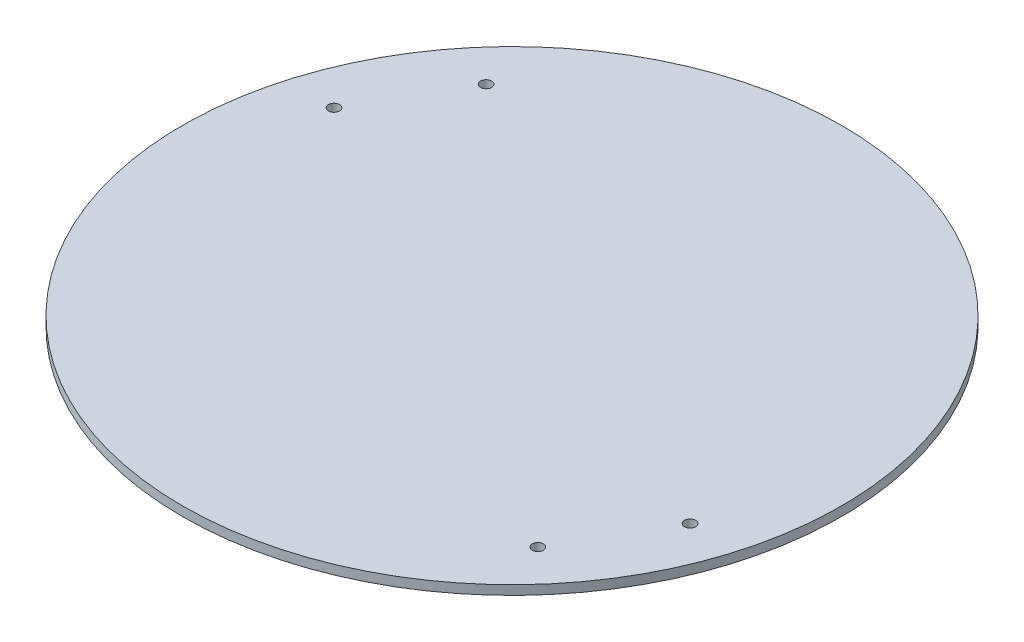
ISO-10303-21;
HEADER;
FILE_DESCRIPTION(('STEP AP214'),'2;1');
FILE_NAME('part.step','',(''),(''),'','','');
FILE_SCHEMA(('AUTOMOTIVE_DESIGN { 1 0 10303 214 1 1 1 1 }'));
ENDSEC;
DATA;
#1=APPLICATION_CONTEXT('core data for automotive mechanical design processes');
#2=APPLICATION_PROTOCOL_DEFINITION('international standard','automotive_design',2000,#1);
#3=PRODUCT_CONTEXT('',#1,'mechanical');
#4=PRODUCT('Part','Part','',(#3));
#5=PRODUCT_RELATED_PRODUCT_CATEGORY('part','',(#4));
#6=PRODUCT_DEFINITION_FORMATION('','',#4);
#7=PRODUCT_DEFINITION_CONTEXT('part definition',#1,'design');
#8=PRODUCT_DEFINITION('design','',#6,#7);
#9=PRODUCT_DEFINITION_SHAPE('','',#8);
#10=(LENGTH_UNIT() NAMED_UNIT(*) SI_UNIT(.MILLI.,.METRE.));
#11=(NAMED_UNIT(*) PLANE_ANGLE_UNIT() SI_UNIT($,.RADIAN.));
#12=(NAMED_UNIT(*) SI_UNIT($,.STERADIAN.) SOLID_ANGLE_UNIT());
#13=UNCERTAINTY_MEASURE_WITH_UNIT(LENGTH_MEASURE(1.E-05),#10,'distance_accuracy_value','');
#14=(GEOMETRIC_REPRESENTATION_CONTEXT(3) GLOBAL_UNCERTAINTY_ASSIGNED_CONTEXT((#13)) GLOBAL_UNIT_ASSIGNED_CONTEXT((#10,
#11,#12)) REPRESENTATION_CONTEXT('',''));
#15=CARTESIAN_POINT('',(0.,0.,0.));
#16=DIRECTION('',(0.,0.,1.));
#17=DIRECTION('',(1.,0.,0.));
#18=AXIS2_PLACEMENT_3D('',#15,#16,#17);
#19=CARTESIAN_POINT('',(135.338999709347,5.,117.383106000489));
#20=DIRECTION('',(0.,1.,0.));
#21=DIRECTION('',(0.,0.,1.));
#22=AXIS2_PLACEMENT_3D('',#19,#20,#21);
#23=PLANE('',#22);
#24=CARTESIAN_POINT('',(250.242810277012,5.,218.363868114023));
#25=DIRECTION('',(0.,1.,0.));
#26=DIRECTION('',(0.,0.,1.));
#27=AXIS2_PLACEMENT_3D('',#24,#25,#26);
#28=CIRCLE('',#27,2.99999999999999);
#29=CARTESIAN_POINT('',(250.242810277012,5.,221.363868114023));
#30=VERTEX_POINT('',#29);
#31=EDGE_CURVE('E59',#30,#30,#28,.T.);
#32=ORIENTED_EDGE('',*,*,#31,.F.);
#33=EDGE_LOOP('',(#32));
#34=FACE_BOUND('',#33,.T.);
#35=CARTESIAN_POINT('',(20.4351891416824,5.,16.4023438869544));
#36=DIRECTION('',(0.,1.,0.));
#37=DIRECTION('',(0.,0.,1.));
#38=AXIS2_PLACEMENT_3D('',#35,#36,#37);
#39=CIRCLE('',#38,3.);
#40=CARTESIAN_POINT('',(20.4351891416824,5.,19.4023438869544));
#41=VERTEX_POINT('',#40);
#42=EDGE_CURVE('E48',#41,#41,#39,.T.);
#43=ORIENTED_EDGE('',*,*,#42,.F.);
#44=EDGE_LOOP('',(#43));
#45=FACE_BOUND('',#44,.T.);
#46=CARTESIAN_POINT('',(135.338999709347,5.,117.383106000489));
#47=DIRECTION('',(0.,1.,0.));
#48=DIRECTION('',(0.,0.,1.));
#49=AXIS2_PLACEMENT_3D('',#46,#47,#48);
#50=CIRCLE('',#49,177.5);
#51=CARTESIAN_POINT('',(135.338999709347,5.,294.883106000489));
#52=VERTEX_POINT('',#51);
#53=EDGE_CURVE('E10',#52,#52,#50,.T.);
#54=ORIENTED_EDGE('',*,*,#53,.T.);
#55=EDGE_LOOP('',(#54));
#56=FACE_BOUND('',#55,.T.);
#57=CARTESIAN_POINT('',(-9.56481085831853,5.,68.3638681140218));
#58=DIRECTION('',(0.,1.,0.));
#59=DIRECTION('',(0.,0.,1.));
#60=AXIS2_PLACEMENT_3D('',#57,#58,#59);
#61=CIRCLE('',#60,3.);
#62=CARTESIAN_POINT('',(-9.56481085831853,5.,71.3638681140218));
#63=VERTEX_POINT('',#62);
#64=EDGE_CURVE('E53',#63,#63,#61,.T.);
#65=ORIENTED_EDGE('',*,*,#64,.F.);
#66=EDGE_LOOP('',(#65));
#67=FACE_BOUND('',#66,.T.);
#68=CARTESIAN_POINT('',(280.242810277013,5.,166.402343886955));
#69=DIRECTION('',(0.,1.,0.));
#70=DIRECTION('',(0.,0.,1.));
#71=AXIS2_PLACEMENT_3D('',#68,#69,#70);
#72=CIRCLE('',#71,2.99999999999999);
#73=CARTESIAN_POINT('',(280.242810277013,5.,169.402343886955));
#74=VERTEX_POINT('',#73);
#75=EDGE_CURVE('E65',#74,#74,#72,.T.);
#76=ORIENTED_EDGE('',*,*,#75,.F.);
#77=EDGE_LOOP('',(#76));
#78=FACE_BOUND('',#77,.T.);
#79=ADVANCED_FACE('F37',(#34,#45,#56,#67,#78),#23,.T.);
#80=CARTESIAN_POINT('',(135.338999709347,0.,117.383106000489));
#81=DIRECTION('',(0.,1.,0.));
#82=DIRECTION('',(0.,0.,1.));
#83=AXIS2_PLACEMENT_3D('',#80,#81,#82);
#84=PLANE('',#83);
#85=CARTESIAN_POINT('',(135.338999709347,0.,117.383106000489));
#86=DIRECTION('',(0.,1.,0.));
#87=DIRECTION('',(0.,0.,1.));
#88=AXIS2_PLACEMENT_3D('',#85,#86,#87);
#89=CIRCLE('',#88,177.5);
#90=CARTESIAN_POINT('',(135.338999709347,0.,294.883106000489));
#91=VERTEX_POINT('',#90);
#92=EDGE_CURVE('E41',#91,#91,#89,.T.);
#93=ORIENTED_EDGE('',*,*,#92,.F.);
#94=EDGE_LOOP('',(#93));
#95=FACE_BOUND('',#94,.T.);
#96=CARTESIAN_POINT('',(20.4351891416824,0.,16.4023438869544));
#97=DIRECTION('',(0.,1.,0.));
#98=DIRECTION('',(0.,0.,1.));
#99=AXIS2_PLACEMENT_3D('',#96,#97,#98);
#100=CIRCLE('',#99,3.);
#101=CARTESIAN_POINT('',(20.4351891416824,0.,19.4023438869544));
#102=VERTEX_POINT('',#101);
#103=EDGE_CURVE('E50',#102,#102,#100,.T.);
#104=ORIENTED_EDGE('',*,*,#103,.T.);
#105=EDGE_LOOP('',(#104));
#106=FACE_BOUND('',#105,.T.);
#107=CARTESIAN_POINT('',(-9.56481085831853,0.,68.3638681140218));
#108=DIRECTION('',(0.,1.,0.));
#109=DIRECTION('',(0.,0.,1.));
#110=AXIS2_PLACEMENT_3D('',#107,#108,#109);
#111=CIRCLE('',#110,3.);
#112=CARTESIAN_POINT('',(-9.56481085831853,0.,71.3638681140218));
#113=VERTEX_POINT('',#112);
#114=EDGE_CURVE('E56',#113,#113,#111,.T.);
#115=ORIENTED_EDGE('',*,*,#114,.T.);
#116=EDGE_LOOP('',(#115));
#117=FACE_BOUND('',#116,.T.);
#118=CARTESIAN_POINT('',(250.242810277012,0.,218.363868114023));
#119=DIRECTION('',(0.,1.,0.));
#120=DIRECTION('',(0.,0.,1.));
#121=AXIS2_PLACEMENT_3D('',#118,#119,#120);
#122=CIRCLE('',#121,2.99999999999999);
#123=CARTESIAN_POINT('',(250.242810277012,0.,221.363868114023));
#124=VERTEX_POINT('',#123);
#125=EDGE_CURVE('E62',#124,#124,#122,.T.);
#126=ORIENTED_EDGE('',*,*,#125,.T.);
#127=EDGE_LOOP('',(#126));
#128=FACE_BOUND('',#127,.T.);
#129=CARTESIAN_POINT('',(280.242810277013,0.,166.402343886955));
#130=DIRECTION('',(0.,1.,0.));
#131=DIRECTION('',(0.,0.,1.));
#132=AXIS2_PLACEMENT_3D('',#129,#130,#131);
#133=CIRCLE('',#132,2.99999999999999);
#134=CARTESIAN_POINT('',(280.242810277013,0.,169.402343886955));
#135=VERTEX_POINT('',#134);
#136=EDGE_CURVE('E68',#135,#135,#133,.T.);
#137=ORIENTED_EDGE('',*,*,#136,.T.);
#138=EDGE_LOOP('',(#137));
#139=FACE_BOUND('',#138,.T.);
#140=ADVANCED_FACE('F78',(#95,#106,#117,#128,#139),#84,.F.);
#141=CARTESIAN_POINT('',(135.338999709347,5.,117.383106000489));
#142=DIRECTION('',(0.,-1.,0.));
#143=DIRECTION('',(0.,0.,-1.));
#144=AXIS2_PLACEMENT_3D('',#141,#142,#143);
#145=CYLINDRICAL_SURFACE('',#144,177.5);
#146=ORIENTED_EDGE('',*,*,#53,.F.);
#147=EDGE_LOOP('',(#146));
#148=FACE_BOUND('',#147,.T.);
#149=ORIENTED_EDGE('',*,*,#92,.T.);
#150=EDGE_LOOP('',(#149));
#151=FACE_BOUND('',#150,.T.);
#152=ADVANCED_FACE('F39',(#148,#151),#145,.T.);
#153=CARTESIAN_POINT('',(20.4351891416824,5.,16.4023438869544));
#154=DIRECTION('',(0.,-1.,0.));
#155=DIRECTION('',(0.,0.,-1.));
#156=AXIS2_PLACEMENT_3D('',#153,#154,#155);
#157=CYLINDRICAL_SURFACE('',#156,3.);
#158=ORIENTED_EDGE('',*,*,#42,.T.);
#159=EDGE_LOOP('',(#158));
#160=FACE_BOUND('',#159,.T.);
#161=ORIENTED_EDGE('',*,*,#103,.F.);
#162=EDGE_LOOP('',(#161));
#163=FACE_BOUND('',#162,.T.);
#164=ADVANCED_FACE('F88',(#160,#163),#157,.F.);
#165=CARTESIAN_POINT('',(-9.56481085831853,5.,68.3638681140218));
#166=DIRECTION('',(0.,-1.,0.));
#167=DIRECTION('',(0.,0.,-1.));
#168=AXIS2_PLACEMENT_3D('',#165,#166,#167);
#169=CYLINDRICAL_SURFACE('',#168,3.);
#170=ORIENTED_EDGE('',*,*,#64,.T.);
#171=EDGE_LOOP('',(#170));
#172=FACE_BOUND('',#171,.T.);
#173=ORIENTED_EDGE('',*,*,#114,.F.);
#174=EDGE_LOOP('',(#173));
#175=FACE_BOUND('',#174,.T.);
#176=ADVANCED_FACE('F91',(#172,#175),#169,.F.);
#177=CARTESIAN_POINT('',(250.242810277012,5.,218.363868114023));
#178=DIRECTION('',(0.,-1.,0.));
#179=DIRECTION('',(0.,0.,-1.));
#180=AXIS2_PLACEMENT_3D('',#177,#178,#179);
#181=CYLINDRICAL_SURFACE('',#180,2.99999999999999);
#182=ORIENTED_EDGE('',*,*,#31,.T.);
#183=EDGE_LOOP('',(#182));
#184=FACE_BOUND('',#183,.T.);
#185=ORIENTED_EDGE('',*,*,#125,.F.);
#186=EDGE_LOOP('',(#185));
#187=FACE_BOUND('',#186,.T.);
#188=ADVANCED_FACE('F95',(#184,#187),#181,.F.);
#189=CARTESIAN_POINT('',(280.242810277013,5.,166.402343886955));
#190=DIRECTION('',(0.,-1.,0.));
#191=DIRECTION('',(0.,0.,-1.));
#192=AXIS2_PLACEMENT_3D('',#189,#190,#191);
#193=CYLINDRICAL_SURFACE('',#192,2.99999999999999);
#194=ORIENTED_EDGE('',*,*,#75,.T.);
#195=EDGE_LOOP('',(#194));
#196=FACE_BOUND('',#195,.T.);
#197=ORIENTED_EDGE('',*,*,#136,.F.);
#198=EDGE_LOOP('',(#197));
#199=FACE_BOUND('',#198,.T.);
#200=ADVANCED_FACE('F74',(#196,#199),#193,.F.);
#201=CLOSED_SHELL('',(#79,#140,#152,#164,#176,#188,#200));
#202=MANIFOLD_SOLID_BREP('B2',#201);
#203=ADVANCED_BREP_SHAPE_REPRESENTATION('',(#18,#202),#14);
#204=SHAPE_DEFINITION_REPRESENTATION(#9,#203);
ENDSEC;
END-ISO-10303-21;
